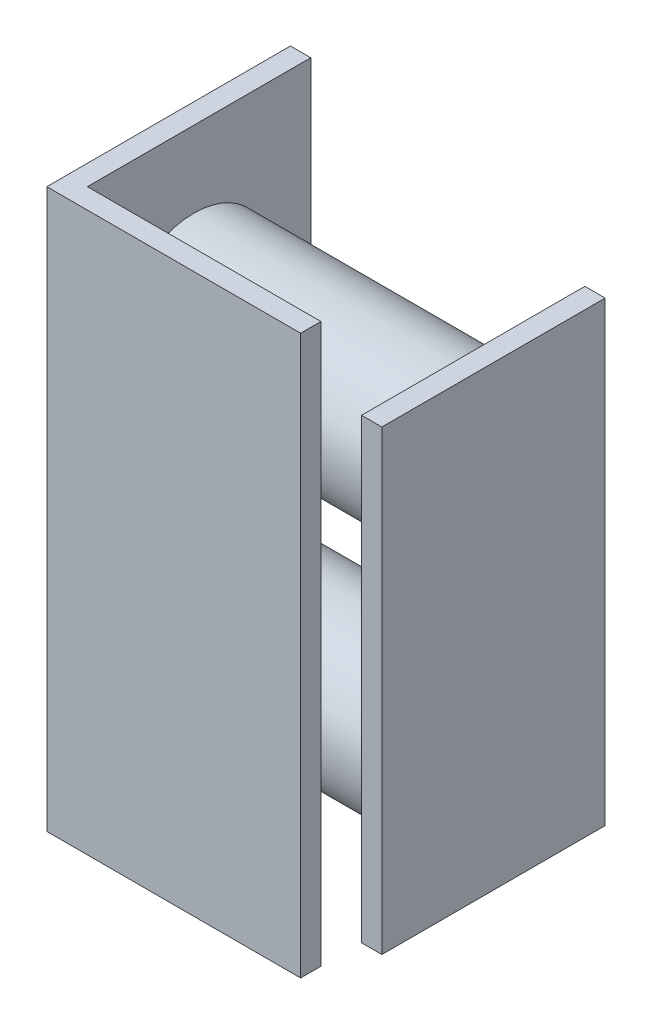
ISO-10303-21;
HEADER;
FILE_DESCRIPTION(('STEP AP214'),'2;1');
FILE_NAME('part.step','',(''),(''),'','','');
FILE_SCHEMA(('AUTOMOTIVE_DESIGN { 1 0 10303 214 1 1 1 1 }'));
ENDSEC;
DATA;
#1=APPLICATION_CONTEXT('core data for automotive mechanical design processes');
#2=APPLICATION_PROTOCOL_DEFINITION('international standard','automotive_design',2000,#1);
#3=PRODUCT_CONTEXT('',#1,'mechanical');
#4=PRODUCT('Part','Part','',(#3));
#5=PRODUCT_RELATED_PRODUCT_CATEGORY('part','',(#4));
#6=PRODUCT_DEFINITION_FORMATION('','',#4);
#7=PRODUCT_DEFINITION_CONTEXT('part definition',#1,'design');
#8=PRODUCT_DEFINITION('design','',#6,#7);
#9=PRODUCT_DEFINITION_SHAPE('','',#8);
#10=(LENGTH_UNIT() NAMED_UNIT(*) SI_UNIT(.MILLI.,.METRE.));
#11=(NAMED_UNIT(*) PLANE_ANGLE_UNIT() SI_UNIT($,.RADIAN.));
#12=(NAMED_UNIT(*) SI_UNIT($,.STERADIAN.) SOLID_ANGLE_UNIT());
#13=UNCERTAINTY_MEASURE_WITH_UNIT(LENGTH_MEASURE(1.E-05),#10,'distance_accuracy_value','');
#14=(GEOMETRIC_REPRESENTATION_CONTEXT(3) GLOBAL_UNCERTAINTY_ASSIGNED_CONTEXT((#13)) GLOBAL_UNIT_ASSIGNED_CONTEXT((#10,
#11,#12)) REPRESENTATION_CONTEXT('',''));
#15=CARTESIAN_POINT('',(0.,0.,0.));
#16=DIRECTION('',(0.,0.,1.));
#17=DIRECTION('',(1.,0.,0.));
#18=AXIS2_PLACEMENT_3D('',#15,#16,#17);
#19=CARTESIAN_POINT('',(32.,50.,-23.));
#20=DIRECTION('',(0.,0.,1.));
#21=DIRECTION('',(1.,0.,0.));
#22=AXIS2_PLACEMENT_3D('',#19,#20,#21);
#23=PLANE('',#22);
#24=DIRECTION('',(0.,1.,0.));
#25=VECTOR('',#24,1.);
#26=CARTESIAN_POINT('',(30.,50.,-23.));
#27=LINE('',#26,#25);
#28=CARTESIAN_POINT('',(30.,5.,-23.));
#29=VERTEX_POINT('',#28);
#30=CARTESIAN_POINT('',(30.,50.,-23.));
#31=VERTEX_POINT('',#30);
#32=EDGE_CURVE('E112',#29,#31,#27,.T.);
#33=ORIENTED_EDGE('',*,*,#32,.T.);
#34=DIRECTION('',(-1.,0.,0.));
#35=VECTOR('',#34,1.);
#36=CARTESIAN_POINT('',(32.,50.,-23.));
#37=LINE('',#36,#35);
#38=CARTESIAN_POINT('',(32.,50.,-23.));
#39=VERTEX_POINT('',#38);
#40=EDGE_CURVE('E12',#39,#31,#37,.T.);
#41=ORIENTED_EDGE('',*,*,#40,.F.);
#42=DIRECTION('',(0.,1.,0.));
#43=VECTOR('',#42,1.);
#44=CARTESIAN_POINT('',(32.,50.,-23.));
#45=LINE('',#44,#43);
#46=CARTESIAN_POINT('',(32.,5.,-23.));
#47=VERTEX_POINT('',#46);
#48=EDGE_CURVE('E100',#47,#39,#45,.T.);
#49=ORIENTED_EDGE('',*,*,#48,.F.);
#50=DIRECTION('',(-1.,0.,0.));
#51=VECTOR('',#50,1.);
#52=CARTESIAN_POINT('',(32.,5.,-23.));
#53=LINE('',#52,#51);
#54=EDGE_CURVE('E108',#47,#29,#53,.T.);
#55=ORIENTED_EDGE('',*,*,#54,.T.);
#56=EDGE_LOOP('',(#33,#41,#49,#55));
#57=FACE_BOUND('',#56,.T.);
#58=ADVANCED_FACE('F49',(#57),#23,.F.);
#59=CARTESIAN_POINT('',(32.,50.,-1.));
#60=DIRECTION('',(0.,-1.,0.));
#61=DIRECTION('',(0.,0.,-1.));
#62=AXIS2_PLACEMENT_3D('',#59,#60,#61);
#63=PLANE('',#62);
#64=DIRECTION('',(0.,0.,1.));
#65=VECTOR('',#64,1.);
#66=CARTESIAN_POINT('',(30.,50.,-1.));
#67=LINE('',#66,#65);
#68=CARTESIAN_POINT('',(30.,50.,-1.));
#69=VERTEX_POINT('',#68);
#70=EDGE_CURVE('E104',#31,#69,#67,.T.);
#71=ORIENTED_EDGE('',*,*,#70,.T.);
#72=DIRECTION('',(-1.,0.,0.));
#73=VECTOR('',#72,1.);
#74=CARTESIAN_POINT('',(32.,50.,-1.));
#75=LINE('',#74,#73);
#76=CARTESIAN_POINT('',(32.,50.,-1.));
#77=VERTEX_POINT('',#76);
#78=EDGE_CURVE('E57',#77,#69,#75,.T.);
#79=ORIENTED_EDGE('',*,*,#78,.F.);
#80=DIRECTION('',(0.,0.,1.));
#81=VECTOR('',#80,1.);
#82=CARTESIAN_POINT('',(32.,50.,-1.));
#83=LINE('',#82,#81);
#84=EDGE_CURVE('E95',#39,#77,#83,.T.);
#85=ORIENTED_EDGE('',*,*,#84,.F.);
#86=ORIENTED_EDGE('',*,*,#40,.T.);
#87=EDGE_LOOP('',(#71,#79,#85,#86));
#88=FACE_BOUND('',#87,.T.);
#89=ADVANCED_FACE('F103',(#88),#63,.F.);
#90=CARTESIAN_POINT('',(32.,50.,-1.));
#91=DIRECTION('',(0.,0.,-1.));
#92=DIRECTION('',(-1.,0.,0.));
#93=AXIS2_PLACEMENT_3D('',#90,#91,#92);
#94=PLANE('',#93);
#95=DIRECTION('',(0.,-1.,0.));
#96=VECTOR('',#95,1.);
#97=CARTESIAN_POINT('',(30.,50.,-1.));
#98=LINE('',#97,#96);
#99=CARTESIAN_POINT('',(30.,5.,-1.));
#100=VERTEX_POINT('',#99);
#101=EDGE_CURVE('E82',#69,#100,#98,.T.);
#102=ORIENTED_EDGE('',*,*,#101,.T.);
#103=DIRECTION('',(-1.,0.,0.));
#104=VECTOR('',#103,1.);
#105=CARTESIAN_POINT('',(32.,5.,-1.));
#106=LINE('',#105,#104);
#107=CARTESIAN_POINT('',(32.,5.,-1.));
#108=VERTEX_POINT('',#107);
#109=EDGE_CURVE('E105',#108,#100,#106,.T.);
#110=ORIENTED_EDGE('',*,*,#109,.F.);
#111=DIRECTION('',(0.,-1.,0.));
#112=VECTOR('',#111,1.);
#113=CARTESIAN_POINT('',(32.,50.,-1.));
#114=LINE('',#113,#112);
#115=EDGE_CURVE('E98',#77,#108,#114,.T.);
#116=ORIENTED_EDGE('',*,*,#115,.F.);
#117=ORIENTED_EDGE('',*,*,#78,.T.);
#118=EDGE_LOOP('',(#102,#110,#116,#117));
#119=FACE_BOUND('',#118,.T.);
#120=ADVANCED_FACE('F106',(#119),#94,.F.);
#121=CARTESIAN_POINT('',(32.,5.,-1.));
#122=DIRECTION('',(0.,1.,0.));
#123=DIRECTION('',(0.,0.,1.));
#124=AXIS2_PLACEMENT_3D('',#121,#122,#123);
#125=PLANE('',#124);
#126=DIRECTION('',(0.,0.,-1.));
#127=VECTOR('',#126,1.);
#128=CARTESIAN_POINT('',(30.,5.,-1.));
#129=LINE('',#128,#127);
#130=EDGE_CURVE('E88',#100,#29,#129,.T.);
#131=ORIENTED_EDGE('',*,*,#130,.T.);
#132=ORIENTED_EDGE('',*,*,#54,.F.);
#133=DIRECTION('',(0.,0.,-1.));
#134=VECTOR('',#133,1.);
#135=CARTESIAN_POINT('',(32.,5.,-1.));
#136=LINE('',#135,#134);
#137=EDGE_CURVE('E65',#108,#47,#136,.T.);
#138=ORIENTED_EDGE('',*,*,#137,.F.);
#139=ORIENTED_EDGE('',*,*,#109,.T.);
#140=EDGE_LOOP('',(#131,#132,#138,#139));
#141=FACE_BOUND('',#140,.T.);
#142=ADVANCED_FACE('F119',(#141),#125,.F.);
#143=CARTESIAN_POINT('',(32.,0.,0.));
#144=DIRECTION('',(1.,0.,0.));
#145=DIRECTION('',(0.,0.,-1.));
#146=AXIS2_PLACEMENT_3D('',#143,#144,#145);
#147=PLANE('',#146);
#148=ORIENTED_EDGE('',*,*,#48,.T.);
#149=ORIENTED_EDGE('',*,*,#84,.T.);
#150=ORIENTED_EDGE('',*,*,#115,.T.);
#151=ORIENTED_EDGE('',*,*,#137,.T.);
#152=EDGE_LOOP('',(#148,#149,#150,#151));
#153=FACE_BOUND('',#152,.T.);
#154=ADVANCED_FACE('F96',(#153),#147,.T.);
#155=CARTESIAN_POINT('',(30.,0.,0.));
#156=DIRECTION('',(1.,0.,0.));
#157=DIRECTION('',(0.,0.,-1.));
#158=AXIS2_PLACEMENT_3D('',#155,#156,#157);
#159=PLANE('',#158);
#160=ORIENTED_EDGE('',*,*,#32,.F.);
#161=ORIENTED_EDGE('',*,*,#130,.F.);
#162=ORIENTED_EDGE('',*,*,#101,.F.);
#163=ORIENTED_EDGE('',*,*,#70,.F.);
#164=EDGE_LOOP('',(#160,#161,#162,#163));
#165=FACE_BOUND('',#164,.T.);
#166=ADVANCED_FACE('F122',(#165),#159,.F.);
#167=CLOSED_SHELL('',(#58,#89,#120,#142,#154,#166));
#168=MANIFOLD_SOLID_BREP('B2',#167);
#169=CARTESIAN_POINT('',(0.,55.,-24.));
#170=DIRECTION('',(1.,0.,0.));
#171=DIRECTION('',(0.,0.,-1.));
#172=AXIS2_PLACEMENT_3D('',#169,#170,#171);
#173=PLANE('',#172);
#174=CARTESIAN_POINT('',(0.,40.,-12.5));
#175=DIRECTION('',(1.,0.,0.));
#176=DIRECTION('',(0.,0.,-1.));
#177=AXIS2_PLACEMENT_3D('',#174,#175,#176);
#178=CIRCLE('',#177,7.5);
#179=CARTESIAN_POINT('',(0.,40.,-20.));
#180=VERTEX_POINT('',#179);
#181=EDGE_CURVE('E287',#180,#180,#178,.T.);
#182=ORIENTED_EDGE('',*,*,#181,.T.);
#183=EDGE_LOOP('',(#182));
#184=FACE_BOUND('',#183,.T.);
#185=CARTESIAN_POINT('',(0.,15.,-12.5));
#186=DIRECTION('',(1.,0.,0.));
#187=DIRECTION('',(0.,0.,-1.));
#188=AXIS2_PLACEMENT_3D('',#185,#186,#187);
#189=CIRCLE('',#188,7.5);
#190=CARTESIAN_POINT('',(0.,15.,-20.));
#191=VERTEX_POINT('',#190);
#192=EDGE_CURVE('E262',#191,#191,#189,.T.);
#193=ORIENTED_EDGE('',*,*,#192,.T.);
#194=EDGE_LOOP('',(#193));
#195=FACE_BOUND('',#194,.T.);
#196=DIRECTION('',(0.,0.,1.));
#197=VECTOR('',#196,1.);
#198=CARTESIAN_POINT('',(0.,0.,-24.));
#199=LINE('',#198,#197);
#200=CARTESIAN_POINT('',(0.,0.,-24.));
#201=VERTEX_POINT('',#200);
#202=CARTESIAN_POINT('',(0.,0.,0.));
#203=VERTEX_POINT('',#202);
#204=EDGE_CURVE('E258',#201,#203,#199,.T.);
#205=ORIENTED_EDGE('',*,*,#204,.T.);
#206=DIRECTION('',(0.,-1.,0.));
#207=VECTOR('',#206,1.);
#208=CARTESIAN_POINT('',(0.,55.,0.));
#209=LINE('',#208,#207);
#210=CARTESIAN_POINT('',(0.,55.,0.));
#211=VERTEX_POINT('',#210);
#212=EDGE_CURVE('E47',#211,#203,#209,.T.);
#213=ORIENTED_EDGE('',*,*,#212,.F.);
#214=DIRECTION('',(0.,0.,1.));
#215=VECTOR('',#214,1.);
#216=CARTESIAN_POINT('',(0.,55.,-24.));
#217=LINE('',#216,#215);
#218=CARTESIAN_POINT('',(0.,55.,-24.));
#219=VERTEX_POINT('',#218);
#220=EDGE_CURVE('E269',#219,#211,#217,.T.);
#221=ORIENTED_EDGE('',*,*,#220,.F.);
#222=DIRECTION('',(0.,-1.,0.));
#223=VECTOR('',#222,1.);
#224=CARTESIAN_POINT('',(0.,55.,-24.));
#225=LINE('',#224,#223);
#226=EDGE_CURVE('E254',#219,#201,#225,.T.);
#227=ORIENTED_EDGE('',*,*,#226,.T.);
#228=EDGE_LOOP('',(#205,#213,#221,#227));
#229=FACE_BOUND('',#228,.T.);
#230=ADVANCED_FACE('F172',(#184,#195,#229),#173,.F.);
#231=CARTESIAN_POINT('',(0.,55.,0.));
#232=DIRECTION('',(0.,0.,-1.));
#233=DIRECTION('',(-1.,0.,0.));
#234=AXIS2_PLACEMENT_3D('',#231,#232,#233);
#235=PLANE('',#234);
#236=DIRECTION('',(1.,0.,0.));
#237=VECTOR('',#236,1.);
#238=CARTESIAN_POINT('',(0.,0.,0.));
#239=LINE('',#238,#237);
#240=CARTESIAN_POINT('',(25.,0.,0.));
#241=VERTEX_POINT('',#240);
#242=EDGE_CURVE('E261',#203,#241,#239,.T.);
#243=ORIENTED_EDGE('',*,*,#242,.T.);
#244=DIRECTION('',(0.,-1.,0.));
#245=VECTOR('',#244,1.);
#246=CARTESIAN_POINT('',(25.,55.,0.));
#247=LINE('',#246,#245);
#248=CARTESIAN_POINT('',(25.,55.,0.));
#249=VERTEX_POINT('',#248);
#250=EDGE_CURVE('E181',#249,#241,#247,.T.);
#251=ORIENTED_EDGE('',*,*,#250,.F.);
#252=DIRECTION('',(1.,0.,0.));
#253=VECTOR('',#252,1.);
#254=CARTESIAN_POINT('',(0.,55.,0.));
#255=LINE('',#254,#253);
#256=EDGE_CURVE('E227',#211,#249,#255,.T.);
#257=ORIENTED_EDGE('',*,*,#256,.F.);
#258=ORIENTED_EDGE('',*,*,#212,.T.);
#259=EDGE_LOOP('',(#243,#251,#257,#258));
#260=FACE_BOUND('',#259,.T.);
#261=ADVANCED_FACE('F294',(#260),#235,.F.);
#262=CARTESIAN_POINT('',(25.,55.,0.));
#263=DIRECTION('',(-1.,0.,0.));
#264=DIRECTION('',(0.,0.,1.));
#265=AXIS2_PLACEMENT_3D('',#262,#263,#264);
#266=PLANE('',#265);
#267=DIRECTION('',(0.,0.,-1.));
#268=VECTOR('',#267,1.);
#269=CARTESIAN_POINT('',(25.,0.,0.));
#270=LINE('',#269,#268);
#271=CARTESIAN_POINT('',(25.,0.,-2.));
#272=VERTEX_POINT('',#271);
#273=EDGE_CURVE('E264',#241,#272,#270,.T.);
#274=ORIENTED_EDGE('',*,*,#273,.T.);
#275=DIRECTION('',(0.,-1.,0.));
#276=VECTOR('',#275,1.);
#277=CARTESIAN_POINT('',(25.,55.,-2.));
#278=LINE('',#277,#276);
#279=CARTESIAN_POINT('',(25.,55.,-2.));
#280=VERTEX_POINT('',#279);
#281=EDGE_CURVE('E249',#280,#272,#278,.T.);
#282=ORIENTED_EDGE('',*,*,#281,.F.);
#283=DIRECTION('',(0.,0.,-1.));
#284=VECTOR('',#283,1.);
#285=CARTESIAN_POINT('',(25.,55.,0.));
#286=LINE('',#285,#284);
#287=EDGE_CURVE('E240',#249,#280,#286,.T.);
#288=ORIENTED_EDGE('',*,*,#287,.F.);
#289=ORIENTED_EDGE('',*,*,#250,.T.);
#290=EDGE_LOOP('',(#274,#282,#288,#289));
#291=FACE_BOUND('',#290,.T.);
#292=ADVANCED_FACE('F297',(#291),#266,.F.);
#293=CARTESIAN_POINT('',(25.,55.,-2.));
#294=DIRECTION('',(0.,0.,1.));
#295=DIRECTION('',(1.,0.,0.));
#296=AXIS2_PLACEMENT_3D('',#293,#294,#295);
#297=PLANE('',#296);
#298=DIRECTION('',(-1.,0.,0.));
#299=VECTOR('',#298,1.);
#300=CARTESIAN_POINT('',(25.,0.,-2.));
#301=LINE('',#300,#299);
#302=CARTESIAN_POINT('',(2.,0.,-2.));
#303=VERTEX_POINT('',#302);
#304=EDGE_CURVE('E248',#272,#303,#301,.T.);
#305=ORIENTED_EDGE('',*,*,#304,.T.);
#306=DIRECTION('',(0.,-1.,0.));
#307=VECTOR('',#306,1.);
#308=CARTESIAN_POINT('',(2.,55.,-2.));
#309=LINE('',#308,#307);
#310=CARTESIAN_POINT('',(2.,55.,-2.));
#311=VERTEX_POINT('',#310);
#312=EDGE_CURVE('E245',#311,#303,#309,.T.);
#313=ORIENTED_EDGE('',*,*,#312,.F.);
#314=DIRECTION('',(-1.,0.,0.));
#315=VECTOR('',#314,1.);
#316=CARTESIAN_POINT('',(25.,55.,-2.));
#317=LINE('',#316,#315);
#318=EDGE_CURVE('E234',#280,#311,#317,.T.);
#319=ORIENTED_EDGE('',*,*,#318,.F.);
#320=ORIENTED_EDGE('',*,*,#281,.T.);
#321=EDGE_LOOP('',(#305,#313,#319,#320));
#322=FACE_BOUND('',#321,.T.);
#323=ADVANCED_FACE('F246',(#322),#297,.F.);
#324=CARTESIAN_POINT('',(2.,55.,-2.));
#325=DIRECTION('',(-1.,0.,0.));
#326=DIRECTION('',(0.,0.,1.));
#327=AXIS2_PLACEMENT_3D('',#324,#325,#326);
#328=PLANE('',#327);
#329=CARTESIAN_POINT('',(2.,40.,-12.5));
#330=DIRECTION('',(-1.,0.,0.));
#331=DIRECTION('',(0.,0.,1.));
#332=AXIS2_PLACEMENT_3D('',#329,#330,#331);
#333=CIRCLE('',#332,7.5);
#334=CARTESIAN_POINT('',(2.,40.,-5.));
#335=VERTEX_POINT('',#334);
#336=EDGE_CURVE('E175',#335,#335,#333,.T.);
#337=ORIENTED_EDGE('',*,*,#336,.T.);
#338=EDGE_LOOP('',(#337));
#339=FACE_BOUND('',#338,.T.);
#340=CARTESIAN_POINT('',(2.,15.,-12.5));
#341=DIRECTION('',(-1.,0.,0.));
#342=DIRECTION('',(0.,0.,1.));
#343=AXIS2_PLACEMENT_3D('',#340,#341,#342);
#344=CIRCLE('',#343,7.5);
#345=CARTESIAN_POINT('',(2.,15.,-5.));
#346=VERTEX_POINT('',#345);
#347=EDGE_CURVE('E274',#346,#346,#344,.T.);
#348=ORIENTED_EDGE('',*,*,#347,.T.);
#349=EDGE_LOOP('',(#348));
#350=FACE_BOUND('',#349,.T.);
#351=DIRECTION('',(0.,0.,-1.));
#352=VECTOR('',#351,1.);
#353=CARTESIAN_POINT('',(2.,0.,-2.));
#354=LINE('',#353,#352);
#355=CARTESIAN_POINT('',(2.,0.,-24.));
#356=VERTEX_POINT('',#355);
#357=EDGE_CURVE('E213',#303,#356,#354,.T.);
#358=ORIENTED_EDGE('',*,*,#357,.T.);
#359=DIRECTION('',(0.,-1.,0.));
#360=VECTOR('',#359,1.);
#361=CARTESIAN_POINT('',(2.,55.,-24.));
#362=LINE('',#361,#360);
#363=CARTESIAN_POINT('',(2.,55.,-24.));
#364=VERTEX_POINT('',#363);
#365=EDGE_CURVE('E250',#364,#356,#362,.T.);
#366=ORIENTED_EDGE('',*,*,#365,.F.);
#367=DIRECTION('',(0.,0.,-1.));
#368=VECTOR('',#367,1.);
#369=CARTESIAN_POINT('',(2.,55.,-2.));
#370=LINE('',#369,#368);
#371=EDGE_CURVE('E238',#311,#364,#370,.T.);
#372=ORIENTED_EDGE('',*,*,#371,.F.);
#373=ORIENTED_EDGE('',*,*,#312,.T.);
#374=EDGE_LOOP('',(#358,#366,#372,#373));
#375=FACE_BOUND('',#374,.T.);
#376=ADVANCED_FACE('F252',(#339,#350,#375),#328,.F.);
#377=CARTESIAN_POINT('',(2.,55.,-24.));
#378=DIRECTION('',(0.,0.,1.));
#379=DIRECTION('',(1.,0.,0.));
#380=AXIS2_PLACEMENT_3D('',#377,#378,#379);
#381=PLANE('',#380);
#382=DIRECTION('',(-1.,0.,0.));
#383=VECTOR('',#382,1.);
#384=CARTESIAN_POINT('',(2.,0.,-24.));
#385=LINE('',#384,#383);
#386=EDGE_CURVE('E219',#356,#201,#385,.T.);
#387=ORIENTED_EDGE('',*,*,#386,.T.);
#388=ORIENTED_EDGE('',*,*,#226,.F.);
#389=DIRECTION('',(-1.,0.,0.));
#390=VECTOR('',#389,1.);
#391=CARTESIAN_POINT('',(2.,55.,-24.));
#392=LINE('',#391,#390);
#393=EDGE_CURVE('E190',#364,#219,#392,.T.);
#394=ORIENTED_EDGE('',*,*,#393,.F.);
#395=ORIENTED_EDGE('',*,*,#365,.T.);
#396=EDGE_LOOP('',(#387,#388,#394,#395));
#397=FACE_BOUND('',#396,.T.);
#398=ADVANCED_FACE('F302',(#397),#381,.F.);
#399=CARTESIAN_POINT('',(0.,55.,0.));
#400=DIRECTION('',(0.,1.,0.));
#401=DIRECTION('',(0.,0.,1.));
#402=AXIS2_PLACEMENT_3D('',#399,#400,#401);
#403=PLANE('',#402);
#404=ORIENTED_EDGE('',*,*,#220,.T.);
#405=ORIENTED_EDGE('',*,*,#256,.T.);
#406=ORIENTED_EDGE('',*,*,#287,.T.);
#407=ORIENTED_EDGE('',*,*,#318,.T.);
#408=ORIENTED_EDGE('',*,*,#371,.T.);
#409=ORIENTED_EDGE('',*,*,#393,.T.);
#410=EDGE_LOOP('',(#404,#405,#406,#407,#408,#409));
#411=FACE_BOUND('',#410,.T.);
#412=ADVANCED_FACE('F236',(#411),#403,.T.);
#413=CARTESIAN_POINT('',(0.,0.,0.));
#414=DIRECTION('',(0.,1.,0.));
#415=DIRECTION('',(0.,0.,1.));
#416=AXIS2_PLACEMENT_3D('',#413,#414,#415);
#417=PLANE('',#416);
#418=ORIENTED_EDGE('',*,*,#204,.F.);
#419=ORIENTED_EDGE('',*,*,#386,.F.);
#420=ORIENTED_EDGE('',*,*,#357,.F.);
#421=ORIENTED_EDGE('',*,*,#304,.F.);
#422=ORIENTED_EDGE('',*,*,#273,.F.);
#423=ORIENTED_EDGE('',*,*,#242,.F.);
#424=EDGE_LOOP('',(#418,#419,#420,#421,#422,#423));
#425=FACE_BOUND('',#424,.T.);
#426=ADVANCED_FACE('F300',(#425),#417,.F.);
#427=CARTESIAN_POINT('',(30.,15.,-12.5));
#428=DIRECTION('',(-1.,0.,0.));
#429=DIRECTION('',(0.,0.,1.));
#430=AXIS2_PLACEMENT_3D('',#427,#428,#429);
#431=PLANE('',#430);
#432=CARTESIAN_POINT('',(30.,15.,-12.5));
#433=DIRECTION('',(-1.,0.,0.));
#434=DIRECTION('',(0.,0.,1.));
#435=AXIS2_PLACEMENT_3D('',#432,#433,#434);
#436=CIRCLE('',#435,7.5);
#437=CARTESIAN_POINT('',(30.,15.,-5.));
#438=VERTEX_POINT('',#437);
#439=EDGE_CURVE('E276',#438,#438,#436,.T.);
#440=ORIENTED_EDGE('',*,*,#439,.F.);
#441=EDGE_LOOP('',(#440));
#442=FACE_BOUND('',#441,.T.);
#443=ADVANCED_FACE('F338',(#442),#431,.F.);
#444=CARTESIAN_POINT('',(30.,15.,-12.5));
#445=DIRECTION('',(-1.,0.,0.));
#446=DIRECTION('',(0.,0.,1.));
#447=AXIS2_PLACEMENT_3D('',#444,#445,#446);
#448=CYLINDRICAL_SURFACE('',#447,7.5);
#449=ORIENTED_EDGE('',*,*,#439,.T.);
#450=EDGE_LOOP('',(#449));
#451=FACE_BOUND('',#450,.T.);
#452=ORIENTED_EDGE('',*,*,#347,.F.);
#453=EDGE_LOOP('',(#452));
#454=FACE_BOUND('',#453,.T.);
#455=ADVANCED_FACE('F328',(#451,#454),#448,.T.);
#456=CARTESIAN_POINT('',(-1.,15.,-12.5));
#457=DIRECTION('',(-1.,0.,0.));
#458=DIRECTION('',(0.,0.,1.));
#459=AXIS2_PLACEMENT_3D('',#456,#457,#458);
#460=CIRCLE('',#459,7.5);
#461=CARTESIAN_POINT('',(-1.,15.,-5.));
#462=VERTEX_POINT('',#461);
#463=EDGE_CURVE('E282',#462,#462,#460,.T.);
#464=ORIENTED_EDGE('',*,*,#463,.F.);
#465=EDGE_LOOP('',(#464));
#466=FACE_BOUND('',#465,.T.);
#467=ORIENTED_EDGE('',*,*,#192,.F.);
#468=EDGE_LOOP('',(#467));
#469=FACE_BOUND('',#468,.T.);
#470=ADVANCED_FACE('F325',(#466,#469),#448,.T.);
#471=CARTESIAN_POINT('',(-1.,15.,-12.5));
#472=DIRECTION('',(-1.,0.,0.));
#473=DIRECTION('',(0.,0.,1.));
#474=AXIS2_PLACEMENT_3D('',#471,#472,#473);
#475=PLANE('',#474);
#476=ORIENTED_EDGE('',*,*,#463,.T.);
#477=EDGE_LOOP('',(#476));
#478=FACE_BOUND('',#477,.T.);
#479=ADVANCED_FACE('F327',(#478),#475,.T.);
#480=CARTESIAN_POINT('',(30.,40.,-12.5));
#481=DIRECTION('',(-1.,0.,0.));
#482=DIRECTION('',(0.,0.,1.));
#483=AXIS2_PLACEMENT_3D('',#480,#481,#482);
#484=PLANE('',#483);
#485=CARTESIAN_POINT('',(30.,40.,-12.5));
#486=DIRECTION('',(-1.,0.,0.));
#487=DIRECTION('',(0.,0.,1.));
#488=AXIS2_PLACEMENT_3D('',#485,#486,#487);
#489=CIRCLE('',#488,7.5);
#490=CARTESIAN_POINT('',(30.,40.,-5.));
#491=VERTEX_POINT('',#490);
#492=EDGE_CURVE('E406',#491,#491,#489,.T.);
#493=ORIENTED_EDGE('',*,*,#492,.F.);
#494=EDGE_LOOP('',(#493));
#495=FACE_BOUND('',#494,.T.);
#496=ADVANCED_FACE('F335',(#495),#484,.F.);
#497=CARTESIAN_POINT('',(30.,40.,-12.5));
#498=DIRECTION('',(-1.,0.,0.));
#499=DIRECTION('',(0.,0.,1.));
#500=AXIS2_PLACEMENT_3D('',#497,#498,#499);
#501=CYLINDRICAL_SURFACE('',#500,7.5);
#502=ORIENTED_EDGE('',*,*,#492,.T.);
#503=EDGE_LOOP('',(#502));
#504=FACE_BOUND('',#503,.T.);
#505=ORIENTED_EDGE('',*,*,#336,.F.);
#506=EDGE_LOOP('',(#505));
#507=FACE_BOUND('',#506,.T.);
#508=ADVANCED_FACE('F370',(#504,#507),#501,.T.);
#509=CARTESIAN_POINT('',(-1.,40.,-12.5));
#510=DIRECTION('',(-1.,0.,0.));
#511=DIRECTION('',(0.,0.,1.));
#512=AXIS2_PLACEMENT_3D('',#509,#510,#511);
#513=CIRCLE('',#512,7.5);
#514=CARTESIAN_POINT('',(-1.,40.,-5.));
#515=VERTEX_POINT('',#514);
#516=EDGE_CURVE('E405',#515,#515,#513,.T.);
#517=ORIENTED_EDGE('',*,*,#516,.F.);
#518=EDGE_LOOP('',(#517));
#519=FACE_BOUND('',#518,.T.);
#520=ORIENTED_EDGE('',*,*,#181,.F.);
#521=EDGE_LOOP('',(#520));
#522=FACE_BOUND('',#521,.T.);
#523=ADVANCED_FACE('F380',(#519,#522),#501,.T.);
#524=CARTESIAN_POINT('',(-1.,40.,-12.5));
#525=DIRECTION('',(-1.,0.,0.));
#526=DIRECTION('',(0.,0.,1.));
#527=AXIS2_PLACEMENT_3D('',#524,#525,#526);
#528=PLANE('',#527);
#529=ORIENTED_EDGE('',*,*,#516,.T.);
#530=EDGE_LOOP('',(#529));
#531=FACE_BOUND('',#530,.T.);
#532=ADVANCED_FACE('F390',(#531),#528,.T.);
#533=CLOSED_SHELL('',(#230,#261,#292,#323,#376,#398,#412,#426,#443,#455,#470,#479,#496,#508,
#523,#532));
#534=MANIFOLD_SOLID_BREP('B6',#533);
#535=ADVANCED_BREP_SHAPE_REPRESENTATION('',(#18,#168,#534),#14);
#536=SHAPE_DEFINITION_REPRESENTATION(#9,#535);
ENDSEC;
END-ISO-10303-21;
